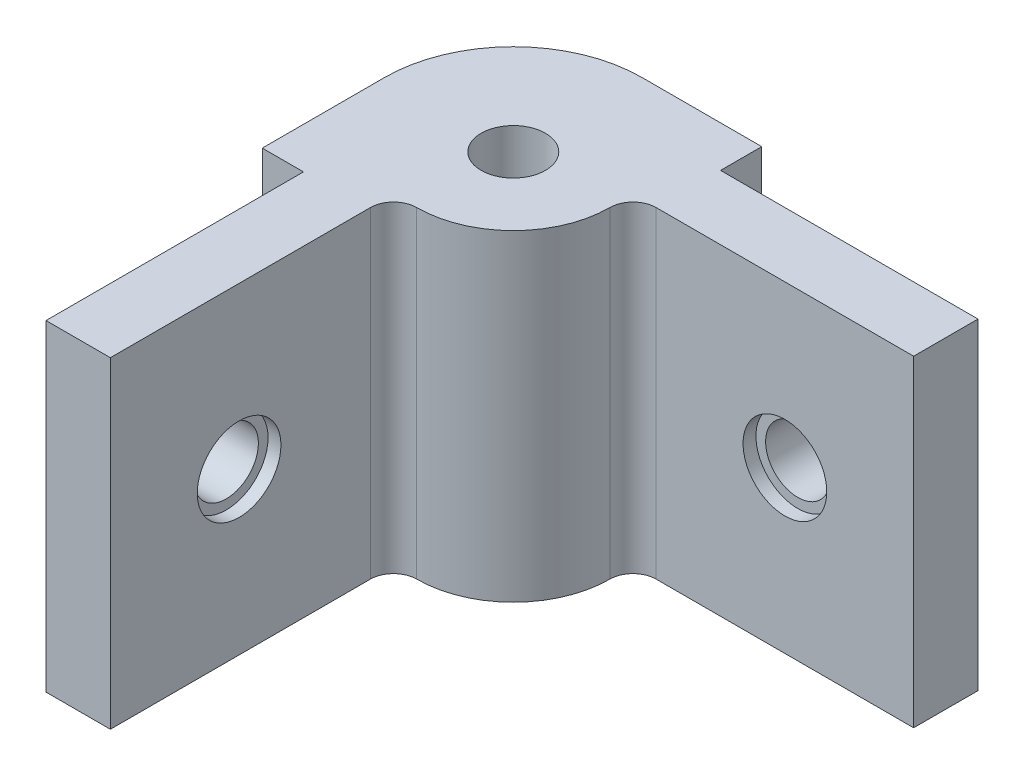
ISO-10303-21;
HEADER;
FILE_DESCRIPTION(('STEP AP214'),'2;1');
FILE_NAME('part.step','',(''),(''),'','','');
FILE_SCHEMA(('AUTOMOTIVE_DESIGN { 1 0 10303 214 1 1 1 1 }'));
ENDSEC;
DATA;
#1=APPLICATION_CONTEXT('core data for automotive mechanical design processes');
#2=APPLICATION_PROTOCOL_DEFINITION('international standard','automotive_design',2000,#1);
#3=PRODUCT_CONTEXT('',#1,'mechanical');
#4=PRODUCT('Part','Part','',(#3));
#5=PRODUCT_RELATED_PRODUCT_CATEGORY('part','',(#4));
#6=PRODUCT_DEFINITION_FORMATION('','',#4);
#7=PRODUCT_DEFINITION_CONTEXT('part definition',#1,'design');
#8=PRODUCT_DEFINITION('design','',#6,#7);
#9=PRODUCT_DEFINITION_SHAPE('','',#8);
#10=(LENGTH_UNIT() NAMED_UNIT(*) SI_UNIT(.MILLI.,.METRE.));
#11=(NAMED_UNIT(*) PLANE_ANGLE_UNIT() SI_UNIT($,.RADIAN.));
#12=(NAMED_UNIT(*) SI_UNIT($,.STERADIAN.) SOLID_ANGLE_UNIT());
#13=UNCERTAINTY_MEASURE_WITH_UNIT(LENGTH_MEASURE(1.E-05),#10,'distance_accuracy_value','');
#14=(GEOMETRIC_REPRESENTATION_CONTEXT(3) GLOBAL_UNCERTAINTY_ASSIGNED_CONTEXT((#13)) GLOBAL_UNIT_ASSIGNED_CONTEXT((#10,
#11,#12)) REPRESENTATION_CONTEXT('',''));
#15=CARTESIAN_POINT('',(0.,0.,0.));
#16=DIRECTION('',(0.,0.,1.));
#17=DIRECTION('',(1.,0.,0.));
#18=AXIS2_PLACEMENT_3D('',#15,#16,#17);
#19=CARTESIAN_POINT('',(22.8596517386988,12.5,16.9988360169487));
#20=DIRECTION('',(0.,0.,-1.));
#21=DIRECTION('',(-1.,0.,0.));
#22=AXIS2_PLACEMENT_3D('',#19,#20,#21);
#23=CYLINDRICAL_SURFACE('',#22,2.50000000000001);
#24=CARTESIAN_POINT('',(22.8596517386988,12.5,-19.3011639830492));
#25=DIRECTION('',(0.,0.,-1.));
#26=DIRECTION('',(-1.,0.,0.));
#27=AXIS2_PLACEMENT_3D('',#24,#25,#26);
#28=CIRCLE('',#27,2.50000000000001);
#29=CARTESIAN_POINT('',(20.3596517386988,12.5,-19.3011639830492));
#30=VERTEX_POINT('',#29);
#31=EDGE_CURVE('E297',#30,#30,#28,.T.);
#32=ORIENTED_EDGE('',*,*,#31,.T.);
#33=EDGE_LOOP('',(#32));
#34=FACE_BOUND('',#33,.T.);
#35=CARTESIAN_POINT('',(22.8596517386988,12.5,-15.3011639830541));
#36=DIRECTION('',(0.,0.,1.));
#37=DIRECTION('',(1.,0.,0.));
#38=AXIS2_PLACEMENT_3D('',#35,#36,#37);
#39=CIRCLE('',#38,2.50000000000001);
#40=CARTESIAN_POINT('',(25.3596517386988,12.5,-15.3011639830541));
#41=VERTEX_POINT('',#40);
#42=EDGE_CURVE('E42',#41,#41,#39,.F.);
#43=ORIENTED_EDGE('',*,*,#42,.F.);
#44=EDGE_LOOP('',(#43));
#45=FACE_BOUND('',#44,.T.);
#46=ADVANCED_FACE('F38',(#34,#45),#23,.F.);
#47=CARTESIAN_POINT('',(-6.44034826133112,12.5,6.99883601694872));
#48=DIRECTION('',(1.,0.,0.));
#49=DIRECTION('',(0.,0.,-1.));
#50=AXIS2_PLACEMENT_3D('',#47,#48,#49);
#51=CYLINDRICAL_SURFACE('',#50,2.5);
#52=CARTESIAN_POINT('',(-3.24034826133112,12.5,6.99883601694872));
#53=DIRECTION('',(1.,0.,0.));
#54=DIRECTION('',(0.,0.,-1.));
#55=AXIS2_PLACEMENT_3D('',#52,#53,#54);
#56=CIRCLE('',#55,2.5);
#57=CARTESIAN_POINT('',(-3.24034826133112,12.5,4.49883601694872));
#58=VERTEX_POINT('',#57);
#59=EDGE_CURVE('E289',#58,#58,#56,.T.);
#60=ORIENTED_EDGE('',*,*,#59,.F.);
#61=EDGE_LOOP('',(#60));
#62=FACE_BOUND('',#61,.T.);
#63=CARTESIAN_POINT('',(0.759651738668881,12.5,6.99883601694872));
#64=DIRECTION('',(1.,0.,0.));
#65=DIRECTION('',(0.,0.,-1.));
#66=AXIS2_PLACEMENT_3D('',#63,#64,#65);
#67=CIRCLE('',#66,2.5);
#68=CARTESIAN_POINT('',(0.759651738668881,12.5,4.49883601694872));
#69=VERTEX_POINT('',#68);
#70=EDGE_CURVE('E286',#69,#69,#67,.F.);
#71=ORIENTED_EDGE('',*,*,#70,.F.);
#72=EDGE_LOOP('',(#71));
#73=FACE_BOUND('',#72,.T.);
#74=ADVANCED_FACE('F378',(#62,#73),#51,.F.);
#75=CARTESIAN_POINT('',(3.55965173866673,25.,-3.20116398305856));
#76=DIRECTION('',(0.,1.,0.));
#77=DIRECTION('',(0.,0.,1.));
#78=AXIS2_PLACEMENT_3D('',#75,#76,#77);
#79=PLANE('',#78);
#80=DIRECTION('',(1.,0.,0.));
#81=VECTOR('',#80,1.);
#82=CARTESIAN_POINT('',(-6.44034826133112,25.,-3.00116398305128));
#83=LINE('',#82,#81);
#84=CARTESIAN_POINT('',(-6.44034826133112,25.,-3.00116398305128));
#85=VERTEX_POINT('',#84);
#86=CARTESIAN_POINT('',(-3.24034826133112,25.,-3.00116398305128));
#87=VERTEX_POINT('',#86);
#88=EDGE_CURVE('E246',#85,#87,#83,.T.);
#89=ORIENTED_EDGE('',*,*,#88,.T.);
#90=DIRECTION('',(0.,0.,1.));
#91=VECTOR('',#90,1.);
#92=CARTESIAN_POINT('',(-3.24034826133112,25.,-3.00116398305128));
#93=LINE('',#92,#91);
#94=CARTESIAN_POINT('',(-3.24034826133112,25.,16.9988360169487));
#95=VERTEX_POINT('',#94);
#96=EDGE_CURVE('E138',#87,#95,#93,.T.);
#97=ORIENTED_EDGE('',*,*,#96,.T.);
#98=DIRECTION('',(1.,0.,0.));
#99=VECTOR('',#98,1.);
#100=CARTESIAN_POINT('',(-3.24034826133112,25.,16.9988360169487));
#101=LINE('',#100,#99);
#102=CARTESIAN_POINT('',(1.75965173866888,25.,16.9988360169487));
#103=VERTEX_POINT('',#102);
#104=EDGE_CURVE('E325',#95,#103,#101,.T.);
#105=ORIENTED_EDGE('',*,*,#104,.T.);
#106=DIRECTION('',(0.,0.,-1.));
#107=VECTOR('',#106,1.);
#108=CARTESIAN_POINT('',(1.75965173866888,25.,-3.20116398305856));
#109=LINE('',#108,#107);
#110=CARTESIAN_POINT('',(1.75965173866888,25.,-3.20116398305856));
#111=VERTEX_POINT('',#110);
#112=EDGE_CURVE('E327',#103,#111,#109,.T.);
#113=ORIENTED_EDGE('',*,*,#112,.T.);
#114=CARTESIAN_POINT('',(3.55965173866673,25.,-3.20116398305856));
#115=DIRECTION('',(0.,-1.,0.));
#116=DIRECTION('',(0.,0.,1.));
#117=AXIS2_PLACEMENT_3D('',#114,#115,#116);
#118=CIRCLE('',#117,1.79999999999785);
#119=CARTESIAN_POINT('',(3.55965173866673,25.,-5.00116398305641));
#120=VERTEX_POINT('',#119);
#121=EDGE_CURVE('E329',#111,#120,#118,.T.);
#122=ORIENTED_EDGE('',*,*,#121,.T.);
#123=CARTESIAN_POINT('',(3.55965173866673,25.,-12.5011639830562));
#124=DIRECTION('',(0.,1.,0.));
#125=DIRECTION('',(0.,0.,-1.));
#126=AXIS2_PLACEMENT_3D('',#123,#124,#125);
#127=CIRCLE('',#126,7.49999999999982);
#128=CARTESIAN_POINT('',(11.0596517386666,25.,-12.5011639830562));
#129=VERTEX_POINT('',#128);
#130=EDGE_CURVE('E332',#120,#129,#127,.T.);
#131=ORIENTED_EDGE('',*,*,#130,.T.);
#132=CARTESIAN_POINT('',(12.8596517386644,25.,-12.5011639830562));
#133=DIRECTION('',(0.,-1.,0.));
#134=DIRECTION('',(0.,0.,-1.));
#135=AXIS2_PLACEMENT_3D('',#132,#133,#134);
#136=CIRCLE('',#135,1.79999999999785);
#137=CARTESIAN_POINT('',(12.8596517386644,25.,-14.3011639830541));
#138=VERTEX_POINT('',#137);
#139=EDGE_CURVE('E335',#129,#138,#136,.T.);
#140=ORIENTED_EDGE('',*,*,#139,.T.);
#141=DIRECTION('',(1.,0.,0.));
#142=VECTOR('',#141,1.);
#143=CARTESIAN_POINT('',(12.8596517386644,25.,-14.3011639830541));
#144=LINE('',#143,#142);
#145=CARTESIAN_POINT('',(32.8596517386987,25.,-14.3011639830541));
#146=VERTEX_POINT('',#145);
#147=EDGE_CURVE('E337',#138,#146,#144,.T.);
#148=ORIENTED_EDGE('',*,*,#147,.T.);
#149=DIRECTION('',(0.,0.,-1.));
#150=VECTOR('',#149,1.);
#151=CARTESIAN_POINT('',(32.8596517386987,25.,-19.3011639830492));
#152=LINE('',#151,#150);
#153=CARTESIAN_POINT('',(32.8596517386987,25.,-19.3011639830492));
#154=VERTEX_POINT('',#153);
#155=EDGE_CURVE('E340',#146,#154,#152,.T.);
#156=ORIENTED_EDGE('',*,*,#155,.T.);
#157=DIRECTION('',(-1.,0.,0.));
#158=VECTOR('',#157,1.);
#159=CARTESIAN_POINT('',(12.8596517386989,25.,-19.3011639830492));
#160=LINE('',#159,#158);
#161=CARTESIAN_POINT('',(12.8596517386989,25.,-19.3011639830492));
#162=VERTEX_POINT('',#161);
#163=EDGE_CURVE('E343',#154,#162,#160,.T.);
#164=ORIENTED_EDGE('',*,*,#163,.T.);
#165=DIRECTION('',(0.,0.,-1.));
#166=VECTOR('',#165,1.);
#167=CARTESIAN_POINT('',(12.8596517386989,25.,-22.5011639830541));
#168=LINE('',#167,#166);
#169=CARTESIAN_POINT('',(12.8596517386989,25.,-22.5011639830541));
#170=VERTEX_POINT('',#169);
#171=EDGE_CURVE('E182',#162,#170,#168,.T.);
#172=ORIENTED_EDGE('',*,*,#171,.T.);
#173=DIRECTION('',(-1.,0.,0.));
#174=VECTOR('',#173,1.);
#175=CARTESIAN_POINT('',(3.55965173866673,25.,-22.5011639830541));
#176=LINE('',#175,#174);
#177=CARTESIAN_POINT('',(3.55965173866673,25.,-22.5011639830541));
#178=VERTEX_POINT('',#177);
#179=EDGE_CURVE('E175',#170,#178,#176,.T.);
#180=ORIENTED_EDGE('',*,*,#179,.T.);
#181=CARTESIAN_POINT('',(3.55965173866673,25.,-12.5011639830562));
#182=DIRECTION('',(0.,1.,0.));
#183=DIRECTION('',(0.,0.,1.));
#184=AXIS2_PLACEMENT_3D('',#181,#182,#183);
#185=CIRCLE('',#184,9.99999999999785);
#186=CARTESIAN_POINT('',(-6.44034826133112,25.,-12.5011639830562));
#187=VERTEX_POINT('',#186);
#188=EDGE_CURVE('E180',#178,#187,#185,.T.);
#189=ORIENTED_EDGE('',*,*,#188,.T.);
#190=DIRECTION('',(0.,0.,1.));
#191=VECTOR('',#190,1.);
#192=CARTESIAN_POINT('',(-6.44034826133112,25.,-12.5011639830562));
#193=LINE('',#192,#191);
#194=EDGE_CURVE('E61',#187,#85,#193,.T.);
#195=ORIENTED_EDGE('',*,*,#194,.T.);
#196=EDGE_LOOP('',(#89,#97,#105,#113,#122,#131,#140,#148,#156,#164,#172,#180,#189,#195));
#197=FACE_BOUND('',#196,.T.);
#198=CARTESIAN_POINT('',(3.55965173866673,25.,-12.5011639830562));
#199=DIRECTION('',(0.,1.,0.));
#200=DIRECTION('',(0.,0.,1.));
#201=AXIS2_PLACEMENT_3D('',#198,#199,#200);
#202=CIRCLE('',#201,2.50000000000224);
#203=CARTESIAN_POINT('',(3.55965173866673,25.,-10.001163983054));
#204=VERTEX_POINT('',#203);
#205=EDGE_CURVE('E211',#204,#204,#202,.T.);
#206=ORIENTED_EDGE('',*,*,#205,.F.);
#207=EDGE_LOOP('',(#206));
#208=FACE_BOUND('',#207,.T.);
#209=ADVANCED_FACE('F177',(#197,#208),#79,.T.);
#210=CARTESIAN_POINT('',(3.55965173866673,0.,-3.20116398305856));
#211=DIRECTION('',(0.,1.,0.));
#212=DIRECTION('',(0.,0.,1.));
#213=AXIS2_PLACEMENT_3D('',#210,#211,#212);
#214=PLANE('',#213);
#215=DIRECTION('',(1.,0.,0.));
#216=VECTOR('',#215,1.);
#217=CARTESIAN_POINT('',(-6.44034826133112,0.,-3.00116398305128));
#218=LINE('',#217,#216);
#219=CARTESIAN_POINT('',(-6.44034826133112,0.,-3.00116398305128));
#220=VERTEX_POINT('',#219);
#221=CARTESIAN_POINT('',(-3.24034826133112,0.,-3.00116398305128));
#222=VERTEX_POINT('',#221);
#223=EDGE_CURVE('E206',#220,#222,#218,.T.);
#224=ORIENTED_EDGE('',*,*,#223,.F.);
#225=DIRECTION('',(0.,0.,1.));
#226=VECTOR('',#225,1.);
#227=CARTESIAN_POINT('',(-6.44034826133112,0.,-12.5011639830562));
#228=LINE('',#227,#226);
#229=CARTESIAN_POINT('',(-6.44034826133112,0.,-12.5011639830562));
#230=VERTEX_POINT('',#229);
#231=EDGE_CURVE('E129',#230,#220,#228,.T.);
#232=ORIENTED_EDGE('',*,*,#231,.F.);
#233=CARTESIAN_POINT('',(3.55965173866673,0.,-12.5011639830562));
#234=DIRECTION('',(0.,1.,0.));
#235=DIRECTION('',(0.,0.,1.));
#236=AXIS2_PLACEMENT_3D('',#233,#234,#235);
#237=CIRCLE('',#236,9.99999999999785);
#238=CARTESIAN_POINT('',(3.55965173866673,0.,-22.5011639830541));
#239=VERTEX_POINT('',#238);
#240=EDGE_CURVE('E121',#239,#230,#237,.T.);
#241=ORIENTED_EDGE('',*,*,#240,.F.);
#242=DIRECTION('',(-1.,0.,0.));
#243=VECTOR('',#242,1.);
#244=CARTESIAN_POINT('',(3.55965173866673,0.,-22.5011639830541));
#245=LINE('',#244,#243);
#246=CARTESIAN_POINT('',(12.8596517386989,0.,-22.5011639830541));
#247=VERTEX_POINT('',#246);
#248=EDGE_CURVE('E191',#247,#239,#245,.T.);
#249=ORIENTED_EDGE('',*,*,#248,.F.);
#250=DIRECTION('',(0.,0.,-1.));
#251=VECTOR('',#250,1.);
#252=CARTESIAN_POINT('',(12.8596517386989,0.,-22.5011639830541));
#253=LINE('',#252,#251);
#254=CARTESIAN_POINT('',(12.8596517386989,0.,-19.3011639830492));
#255=VERTEX_POINT('',#254);
#256=EDGE_CURVE('E237',#255,#247,#253,.T.);
#257=ORIENTED_EDGE('',*,*,#256,.F.);
#258=DIRECTION('',(-1.,0.,0.));
#259=VECTOR('',#258,1.);
#260=CARTESIAN_POINT('',(12.8596517386989,0.,-19.3011639830492));
#261=LINE('',#260,#259);
#262=CARTESIAN_POINT('',(32.8596517386987,0.,-19.3011639830492));
#263=VERTEX_POINT('',#262);
#264=EDGE_CURVE('E234',#263,#255,#261,.T.);
#265=ORIENTED_EDGE('',*,*,#264,.F.);
#266=DIRECTION('',(0.,0.,-1.));
#267=VECTOR('',#266,1.);
#268=CARTESIAN_POINT('',(32.8596517386987,0.,-19.3011639830492));
#269=LINE('',#268,#267);
#270=CARTESIAN_POINT('',(32.8596517386987,0.,-14.3011639830541));
#271=VERTEX_POINT('',#270);
#272=EDGE_CURVE('E231',#271,#263,#269,.T.);
#273=ORIENTED_EDGE('',*,*,#272,.F.);
#274=DIRECTION('',(1.,0.,0.));
#275=VECTOR('',#274,1.);
#276=CARTESIAN_POINT('',(12.8596517386644,0.,-14.3011639830541));
#277=LINE('',#276,#275);
#278=CARTESIAN_POINT('',(12.8596517386644,0.,-14.3011639830541));
#279=VERTEX_POINT('',#278);
#280=EDGE_CURVE('E228',#279,#271,#277,.T.);
#281=ORIENTED_EDGE('',*,*,#280,.F.);
#282=CARTESIAN_POINT('',(12.8596517386644,0.,-12.5011639830562));
#283=DIRECTION('',(0.,-1.,0.));
#284=DIRECTION('',(0.,0.,-1.));
#285=AXIS2_PLACEMENT_3D('',#282,#283,#284);
#286=CIRCLE('',#285,1.79999999999785);
#287=CARTESIAN_POINT('',(11.0596517386666,0.,-12.5011639830562));
#288=VERTEX_POINT('',#287);
#289=EDGE_CURVE('E225',#288,#279,#286,.T.);
#290=ORIENTED_EDGE('',*,*,#289,.F.);
#291=CARTESIAN_POINT('',(3.55965173866673,0.,-12.5011639830562));
#292=DIRECTION('',(0.,1.,0.));
#293=DIRECTION('',(0.,0.,-1.));
#294=AXIS2_PLACEMENT_3D('',#291,#292,#293);
#295=CIRCLE('',#294,7.49999999999982);
#296=CARTESIAN_POINT('',(3.55965173866673,0.,-5.00116398305641));
#297=VERTEX_POINT('',#296);
#298=EDGE_CURVE('E222',#297,#288,#295,.T.);
#299=ORIENTED_EDGE('',*,*,#298,.F.);
#300=CARTESIAN_POINT('',(3.55965173866673,0.,-3.20116398305856));
#301=DIRECTION('',(0.,-1.,0.));
#302=DIRECTION('',(0.,0.,1.));
#303=AXIS2_PLACEMENT_3D('',#300,#301,#302);
#304=CIRCLE('',#303,1.79999999999785);
#305=CARTESIAN_POINT('',(1.75965173866888,0.,-3.20116398305856));
#306=VERTEX_POINT('',#305);
#307=EDGE_CURVE('E219',#306,#297,#304,.T.);
#308=ORIENTED_EDGE('',*,*,#307,.F.);
#309=DIRECTION('',(0.,0.,-1.));
#310=VECTOR('',#309,1.);
#311=CARTESIAN_POINT('',(1.75965173866888,0.,-3.20116398305856));
#312=LINE('',#311,#310);
#313=CARTESIAN_POINT('',(1.75965173866888,0.,16.9988360169487));
#314=VERTEX_POINT('',#313);
#315=EDGE_CURVE('E216',#314,#306,#312,.T.);
#316=ORIENTED_EDGE('',*,*,#315,.F.);
#317=DIRECTION('',(1.,0.,0.));
#318=VECTOR('',#317,1.);
#319=CARTESIAN_POINT('',(-3.24034826133112,0.,16.9988360169487));
#320=LINE('',#319,#318);
#321=CARTESIAN_POINT('',(-3.24034826133112,0.,16.9988360169487));
#322=VERTEX_POINT('',#321);
#323=EDGE_CURVE('E214',#322,#314,#320,.T.);
#324=ORIENTED_EDGE('',*,*,#323,.F.);
#325=DIRECTION('',(0.,0.,1.));
#326=VECTOR('',#325,1.);
#327=CARTESIAN_POINT('',(-3.24034826133112,0.,-3.00116398305128));
#328=LINE('',#327,#326);
#329=EDGE_CURVE('E210',#222,#322,#328,.T.);
#330=ORIENTED_EDGE('',*,*,#329,.F.);
#331=EDGE_LOOP('',(#224,#232,#241,#249,#257,#265,#273,#281,#290,#299,#308,#316,#324,#330));
#332=FACE_BOUND('',#331,.T.);
#333=CARTESIAN_POINT('',(3.55965173866673,0.,-12.5011639830562));
#334=DIRECTION('',(0.,1.,0.));
#335=DIRECTION('',(0.,0.,1.));
#336=AXIS2_PLACEMENT_3D('',#333,#334,#335);
#337=CIRCLE('',#336,2.50000000000224);
#338=CARTESIAN_POINT('',(3.55965173866673,0.,-10.001163983054));
#339=VERTEX_POINT('',#338);
#340=EDGE_CURVE('E314',#339,#339,#337,.T.);
#341=ORIENTED_EDGE('',*,*,#340,.T.);
#342=EDGE_LOOP('',(#341));
#343=FACE_BOUND('',#342,.T.);
#344=ADVANCED_FACE('F358',(#332,#343),#214,.F.);
#345=CARTESIAN_POINT('',(-6.44034826133112,25.,-3.00116398305128));
#346=DIRECTION('',(0.,0.,-1.));
#347=DIRECTION('',(-1.,0.,0.));
#348=AXIS2_PLACEMENT_3D('',#345,#346,#347);
#349=PLANE('',#348);
#350=ORIENTED_EDGE('',*,*,#223,.T.);
#351=DIRECTION('',(0.,-1.,0.));
#352=VECTOR('',#351,1.);
#353=CARTESIAN_POINT('',(-3.24034826133112,25.,-3.00116398305128));
#354=LINE('',#353,#352);
#355=EDGE_CURVE('E11',#87,#222,#354,.T.);
#356=ORIENTED_EDGE('',*,*,#355,.F.);
#357=ORIENTED_EDGE('',*,*,#88,.F.);
#358=DIRECTION('',(0.,-1.,0.));
#359=VECTOR('',#358,1.);
#360=CARTESIAN_POINT('',(-6.44034826133112,25.,-3.00116398305128));
#361=LINE('',#360,#359);
#362=EDGE_CURVE('E202',#85,#220,#361,.T.);
#363=ORIENTED_EDGE('',*,*,#362,.T.);
#364=EDGE_LOOP('',(#350,#356,#357,#363));
#365=FACE_BOUND('',#364,.T.);
#366=ADVANCED_FACE('F40',(#365),#349,.F.);
#367=CARTESIAN_POINT('',(-3.24034826133112,25.,-3.00116398305128));
#368=DIRECTION('',(1.,0.,0.));
#369=DIRECTION('',(0.,0.,-1.));
#370=AXIS2_PLACEMENT_3D('',#367,#368,#369);
#371=PLANE('',#370);
#372=ORIENTED_EDGE('',*,*,#59,.T.);
#373=EDGE_LOOP('',(#372));
#374=FACE_BOUND('',#373,.T.);
#375=ORIENTED_EDGE('',*,*,#329,.T.);
#376=DIRECTION('',(0.,-1.,0.));
#377=VECTOR('',#376,1.);
#378=CARTESIAN_POINT('',(-3.24034826133112,25.,16.9988360169487));
#379=LINE('',#378,#377);
#380=EDGE_CURVE('E49',#95,#322,#379,.T.);
#381=ORIENTED_EDGE('',*,*,#380,.F.);
#382=ORIENTED_EDGE('',*,*,#96,.F.);
#383=ORIENTED_EDGE('',*,*,#355,.T.);
#384=EDGE_LOOP('',(#375,#381,#382,#383));
#385=FACE_BOUND('',#384,.T.);
#386=ADVANCED_FACE('F394',(#374,#385),#371,.F.);
#387=CARTESIAN_POINT('',(-3.24034826133112,25.,16.9988360169487));
#388=DIRECTION('',(0.,0.,-1.));
#389=DIRECTION('',(-1.,0.,0.));
#390=AXIS2_PLACEMENT_3D('',#387,#388,#389);
#391=PLANE('',#390);
#392=ORIENTED_EDGE('',*,*,#323,.T.);
#393=DIRECTION('',(0.,-1.,0.));
#394=VECTOR('',#393,1.);
#395=CARTESIAN_POINT('',(1.75965173866888,25.,16.9988360169487));
#396=LINE('',#395,#394);
#397=EDGE_CURVE('E281',#103,#314,#396,.T.);
#398=ORIENTED_EDGE('',*,*,#397,.F.);
#399=ORIENTED_EDGE('',*,*,#104,.F.);
#400=ORIENTED_EDGE('',*,*,#380,.T.);
#401=EDGE_LOOP('',(#392,#398,#399,#400));
#402=FACE_BOUND('',#401,.T.);
#403=ADVANCED_FACE('F398',(#402),#391,.F.);
#404=CARTESIAN_POINT('',(1.75965173866888,25.,-3.20116398305856));
#405=DIRECTION('',(-1.,0.,0.));
#406=DIRECTION('',(0.,0.,1.));
#407=AXIS2_PLACEMENT_3D('',#404,#405,#406);
#408=PLANE('',#407);
#409=CARTESIAN_POINT('',(1.75965173866888,12.5,6.99883601694872));
#410=DIRECTION('',(1.,0.,0.));
#411=DIRECTION('',(0.,0.,-1.));
#412=AXIS2_PLACEMENT_3D('',#409,#410,#411);
#413=CIRCLE('',#412,3.25);
#414=CARTESIAN_POINT('',(1.75965173866888,12.5,3.74883601694872));
#415=VERTEX_POINT('',#414);
#416=EDGE_CURVE('E301',#415,#415,#413,.T.);
#417=ORIENTED_EDGE('',*,*,#416,.F.);
#418=EDGE_LOOP('',(#417));
#419=FACE_BOUND('',#418,.T.);
#420=ORIENTED_EDGE('',*,*,#315,.T.);
#421=DIRECTION('',(0.,-1.,0.));
#422=VECTOR('',#421,1.);
#423=CARTESIAN_POINT('',(1.75965173866888,25.,-3.20116398305856));
#424=LINE('',#423,#422);
#425=EDGE_CURVE('E277',#111,#306,#424,.T.);
#426=ORIENTED_EDGE('',*,*,#425,.F.);
#427=ORIENTED_EDGE('',*,*,#112,.F.);
#428=ORIENTED_EDGE('',*,*,#397,.T.);
#429=EDGE_LOOP('',(#420,#426,#427,#428));
#430=FACE_BOUND('',#429,.T.);
#431=ADVANCED_FACE('F403',(#419,#430),#408,.F.);
#432=CARTESIAN_POINT('',(3.55965173866673,25.,-3.20116398305856));
#433=DIRECTION('',(0.,-1.,0.));
#434=DIRECTION('',(0.,0.,-1.));
#435=AXIS2_PLACEMENT_3D('',#432,#433,#434);
#436=CYLINDRICAL_SURFACE('',#435,1.79999999999785);
#437=ORIENTED_EDGE('',*,*,#307,.T.);
#438=DIRECTION('',(0.,-1.,0.));
#439=VECTOR('',#438,1.);
#440=CARTESIAN_POINT('',(3.55965173866673,25.,-5.00116398305641));
#441=LINE('',#440,#439);
#442=EDGE_CURVE('E273',#120,#297,#441,.T.);
#443=ORIENTED_EDGE('',*,*,#442,.F.);
#444=ORIENTED_EDGE('',*,*,#121,.F.);
#445=ORIENTED_EDGE('',*,*,#425,.T.);
#446=EDGE_LOOP('',(#437,#443,#444,#445));
#447=FACE_BOUND('',#446,.T.);
#448=ADVANCED_FACE('F409',(#447),#436,.F.);
#449=CARTESIAN_POINT('',(3.55965173866673,25.,-12.5011639830562));
#450=DIRECTION('',(0.,-1.,0.));
#451=DIRECTION('',(0.,0.,-1.));
#452=AXIS2_PLACEMENT_3D('',#449,#450,#451);
#453=CYLINDRICAL_SURFACE('',#452,7.49999999999982);
#454=ORIENTED_EDGE('',*,*,#298,.T.);
#455=DIRECTION('',(0.,-1.,0.));
#456=VECTOR('',#455,1.);
#457=CARTESIAN_POINT('',(11.0596517386666,25.,-12.5011639830562));
#458=LINE('',#457,#456);
#459=EDGE_CURVE('E269',#129,#288,#458,.T.);
#460=ORIENTED_EDGE('',*,*,#459,.F.);
#461=ORIENTED_EDGE('',*,*,#130,.F.);
#462=ORIENTED_EDGE('',*,*,#442,.T.);
#463=EDGE_LOOP('',(#454,#460,#461,#462));
#464=FACE_BOUND('',#463,.T.);
#465=ADVANCED_FACE('F413',(#464),#453,.T.);
#466=CARTESIAN_POINT('',(12.8596517386644,25.,-12.5011639830562));
#467=DIRECTION('',(0.,-1.,0.));
#468=DIRECTION('',(0.,0.,-1.));
#469=AXIS2_PLACEMENT_3D('',#466,#467,#468);
#470=CYLINDRICAL_SURFACE('',#469,1.79999999999785);
#471=ORIENTED_EDGE('',*,*,#289,.T.);
#472=DIRECTION('',(0.,-1.,0.));
#473=VECTOR('',#472,1.);
#474=CARTESIAN_POINT('',(12.8596517386644,25.,-14.3011639830541));
#475=LINE('',#474,#473);
#476=EDGE_CURVE('E265',#138,#279,#475,.T.);
#477=ORIENTED_EDGE('',*,*,#476,.F.);
#478=ORIENTED_EDGE('',*,*,#139,.F.);
#479=ORIENTED_EDGE('',*,*,#459,.T.);
#480=EDGE_LOOP('',(#471,#477,#478,#479));
#481=FACE_BOUND('',#480,.T.);
#482=ADVANCED_FACE('F417',(#481),#470,.F.);
#483=CARTESIAN_POINT('',(12.8596517386644,25.,-14.3011639830541));
#484=DIRECTION('',(0.,0.,-1.));
#485=DIRECTION('',(-1.,0.,0.));
#486=AXIS2_PLACEMENT_3D('',#483,#484,#485);
#487=PLANE('',#486);
#488=CARTESIAN_POINT('',(22.8596517386988,12.5,-14.3011639830541));
#489=DIRECTION('',(0.,0.,1.));
#490=DIRECTION('',(1.,0.,0.));
#491=AXIS2_PLACEMENT_3D('',#488,#489,#490);
#492=CIRCLE('',#491,3.25);
#493=CARTESIAN_POINT('',(26.1096517386988,12.5,-14.3011639830541));
#494=VERTEX_POINT('',#493);
#495=EDGE_CURVE('E308',#494,#494,#492,.T.);
#496=ORIENTED_EDGE('',*,*,#495,.F.);
#497=EDGE_LOOP('',(#496));
#498=FACE_BOUND('',#497,.T.);
#499=ORIENTED_EDGE('',*,*,#280,.T.);
#500=DIRECTION('',(0.,-1.,0.));
#501=VECTOR('',#500,1.);
#502=CARTESIAN_POINT('',(32.8596517386987,25.,-14.3011639830541));
#503=LINE('',#502,#501);
#504=EDGE_CURVE('E261',#146,#271,#503,.T.);
#505=ORIENTED_EDGE('',*,*,#504,.F.);
#506=ORIENTED_EDGE('',*,*,#147,.F.);
#507=ORIENTED_EDGE('',*,*,#476,.T.);
#508=EDGE_LOOP('',(#499,#505,#506,#507));
#509=FACE_BOUND('',#508,.T.);
#510=ADVANCED_FACE('F421',(#498,#509),#487,.F.);
#511=CARTESIAN_POINT('',(32.8596517386987,25.,-19.3011639830492));
#512=DIRECTION('',(-1.,0.,0.));
#513=DIRECTION('',(0.,0.,1.));
#514=AXIS2_PLACEMENT_3D('',#511,#512,#513);
#515=PLANE('',#514);
#516=ORIENTED_EDGE('',*,*,#272,.T.);
#517=DIRECTION('',(0.,-1.,0.));
#518=VECTOR('',#517,1.);
#519=CARTESIAN_POINT('',(32.8596517386987,25.,-19.3011639830492));
#520=LINE('',#519,#518);
#521=EDGE_CURVE('E257',#154,#263,#520,.T.);
#522=ORIENTED_EDGE('',*,*,#521,.F.);
#523=ORIENTED_EDGE('',*,*,#155,.F.);
#524=ORIENTED_EDGE('',*,*,#504,.T.);
#525=EDGE_LOOP('',(#516,#522,#523,#524));
#526=FACE_BOUND('',#525,.T.);
#527=ADVANCED_FACE('F425',(#526),#515,.F.);
#528=CARTESIAN_POINT('',(12.8596517386989,25.,-19.3011639830492));
#529=DIRECTION('',(0.,0.,1.));
#530=DIRECTION('',(1.,0.,0.));
#531=AXIS2_PLACEMENT_3D('',#528,#529,#530);
#532=PLANE('',#531);
#533=ORIENTED_EDGE('',*,*,#31,.F.);
#534=EDGE_LOOP('',(#533));
#535=FACE_BOUND('',#534,.T.);
#536=ORIENTED_EDGE('',*,*,#264,.T.);
#537=DIRECTION('',(0.,-1.,0.));
#538=VECTOR('',#537,1.);
#539=CARTESIAN_POINT('',(12.8596517386989,25.,-19.3011639830492));
#540=LINE('',#539,#538);
#541=EDGE_CURVE('E253',#162,#255,#540,.T.);
#542=ORIENTED_EDGE('',*,*,#541,.F.);
#543=ORIENTED_EDGE('',*,*,#163,.F.);
#544=ORIENTED_EDGE('',*,*,#521,.T.);
#545=EDGE_LOOP('',(#536,#542,#543,#544));
#546=FACE_BOUND('',#545,.T.);
#547=ADVANCED_FACE('F351',(#535,#546),#532,.F.);
#548=CARTESIAN_POINT('',(12.8596517386989,25.,-22.5011639830541));
#549=DIRECTION('',(-1.,0.,0.));
#550=DIRECTION('',(0.,0.,1.));
#551=AXIS2_PLACEMENT_3D('',#548,#549,#550);
#552=PLANE('',#551);
#553=ORIENTED_EDGE('',*,*,#256,.T.);
#554=DIRECTION('',(0.,-1.,0.));
#555=VECTOR('',#554,1.);
#556=CARTESIAN_POINT('',(12.8596517386989,25.,-22.5011639830541));
#557=LINE('',#556,#555);
#558=EDGE_CURVE('E193',#170,#247,#557,.T.);
#559=ORIENTED_EDGE('',*,*,#558,.F.);
#560=ORIENTED_EDGE('',*,*,#171,.F.);
#561=ORIENTED_EDGE('',*,*,#541,.T.);
#562=EDGE_LOOP('',(#553,#559,#560,#561));
#563=FACE_BOUND('',#562,.T.);
#564=ADVANCED_FACE('F355',(#563),#552,.F.);
#565=CARTESIAN_POINT('',(3.55965173866673,25.,-22.5011639830541));
#566=DIRECTION('',(0.,0.,1.));
#567=DIRECTION('',(1.,0.,0.));
#568=AXIS2_PLACEMENT_3D('',#565,#566,#567);
#569=PLANE('',#568);
#570=ORIENTED_EDGE('',*,*,#248,.T.);
#571=DIRECTION('',(0.,-1.,0.));
#572=VECTOR('',#571,1.);
#573=CARTESIAN_POINT('',(3.55965173866673,25.,-22.5011639830541));
#574=LINE('',#573,#572);
#575=EDGE_CURVE('E188',#178,#239,#574,.T.);
#576=ORIENTED_EDGE('',*,*,#575,.F.);
#577=ORIENTED_EDGE('',*,*,#179,.F.);
#578=ORIENTED_EDGE('',*,*,#558,.T.);
#579=EDGE_LOOP('',(#570,#576,#577,#578));
#580=FACE_BOUND('',#579,.T.);
#581=ADVANCED_FACE('F189',(#580),#569,.F.);
#582=CARTESIAN_POINT('',(3.55965173866673,25.,-12.5011639830562));
#583=DIRECTION('',(0.,-1.,0.));
#584=DIRECTION('',(0.,0.,-1.));
#585=AXIS2_PLACEMENT_3D('',#582,#583,#584);
#586=CYLINDRICAL_SURFACE('',#585,9.99999999999785);
#587=ORIENTED_EDGE('',*,*,#240,.T.);
#588=DIRECTION('',(0.,-1.,0.));
#589=VECTOR('',#588,1.);
#590=CARTESIAN_POINT('',(-6.44034826133112,25.,-12.5011639830562));
#591=LINE('',#590,#589);
#592=EDGE_CURVE('E194',#187,#230,#591,.T.);
#593=ORIENTED_EDGE('',*,*,#592,.F.);
#594=ORIENTED_EDGE('',*,*,#188,.F.);
#595=ORIENTED_EDGE('',*,*,#575,.T.);
#596=EDGE_LOOP('',(#587,#593,#594,#595));
#597=FACE_BOUND('',#596,.T.);
#598=ADVANCED_FACE('F196',(#597),#586,.T.);
#599=CARTESIAN_POINT('',(-6.44034826133112,25.,-12.5011639830562));
#600=DIRECTION('',(1.,0.,0.));
#601=DIRECTION('',(0.,0.,-1.));
#602=AXIS2_PLACEMENT_3D('',#599,#600,#601);
#603=PLANE('',#602);
#604=ORIENTED_EDGE('',*,*,#231,.T.);
#605=ORIENTED_EDGE('',*,*,#362,.F.);
#606=ORIENTED_EDGE('',*,*,#194,.F.);
#607=ORIENTED_EDGE('',*,*,#592,.T.);
#608=EDGE_LOOP('',(#604,#605,#606,#607));
#609=FACE_BOUND('',#608,.T.);
#610=ADVANCED_FACE('F364',(#609),#603,.F.);
#611=CARTESIAN_POINT('',(3.55965173866673,25.,-12.5011639830562));
#612=DIRECTION('',(0.,-1.,0.));
#613=DIRECTION('',(0.,0.,-1.));
#614=AXIS2_PLACEMENT_3D('',#611,#612,#613);
#615=CYLINDRICAL_SURFACE('',#614,2.50000000000224);
#616=ORIENTED_EDGE('',*,*,#205,.T.);
#617=EDGE_LOOP('',(#616));
#618=FACE_BOUND('',#617,.T.);
#619=ORIENTED_EDGE('',*,*,#340,.F.);
#620=EDGE_LOOP('',(#619));
#621=FACE_BOUND('',#620,.T.);
#622=ADVANCED_FACE('F366',(#618,#621),#615,.F.);
#623=CARTESIAN_POINT('',(0.759651738668881,12.5,6.99883601694872));
#624=DIRECTION('',(1.,0.,0.));
#625=DIRECTION('',(0.,0.,-1.));
#626=AXIS2_PLACEMENT_3D('',#623,#624,#625);
#627=PLANE('',#626);
#628=CARTESIAN_POINT('',(0.759651738668881,12.5,6.99883601694872));
#629=DIRECTION('',(1.,0.,0.));
#630=DIRECTION('',(0.,0.,-1.));
#631=AXIS2_PLACEMENT_3D('',#628,#629,#630);
#632=CIRCLE('',#631,3.25);
#633=CARTESIAN_POINT('',(0.759651738668881,12.5,3.74883601694872));
#634=VERTEX_POINT('',#633);
#635=EDGE_CURVE('E290',#634,#634,#632,.T.);
#636=ORIENTED_EDGE('',*,*,#635,.T.);
#637=EDGE_LOOP('',(#636));
#638=FACE_BOUND('',#637,.T.);
#639=ORIENTED_EDGE('',*,*,#70,.T.);
#640=EDGE_LOOP('',(#639));
#641=FACE_BOUND('',#640,.T.);
#642=ADVANCED_FACE('F372',(#638,#641),#627,.T.);
#643=CARTESIAN_POINT('',(0.759651738668881,12.5,6.99883601694872));
#644=DIRECTION('',(1.,0.,0.));
#645=DIRECTION('',(0.,0.,-1.));
#646=AXIS2_PLACEMENT_3D('',#643,#644,#645);
#647=CYLINDRICAL_SURFACE('',#646,3.25);
#648=ORIENTED_EDGE('',*,*,#635,.F.);
#649=EDGE_LOOP('',(#648));
#650=FACE_BOUND('',#649,.T.);
#651=ORIENTED_EDGE('',*,*,#416,.T.);
#652=EDGE_LOOP('',(#651));
#653=FACE_BOUND('',#652,.T.);
#654=ADVANCED_FACE('F521',(#650,#653),#647,.F.);
#655=CARTESIAN_POINT('',(22.8596517386988,12.5,-15.3011639830541));
#656=DIRECTION('',(0.,0.,1.));
#657=DIRECTION('',(1.,0.,0.));
#658=AXIS2_PLACEMENT_3D('',#655,#656,#657);
#659=PLANE('',#658);
#660=CARTESIAN_POINT('',(22.8596517386988,12.5,-15.3011639830541));
#661=DIRECTION('',(0.,0.,1.));
#662=DIRECTION('',(1.,0.,0.));
#663=AXIS2_PLACEMENT_3D('',#660,#661,#662);
#664=CIRCLE('',#663,3.25);
#665=CARTESIAN_POINT('',(26.1096517386988,12.5,-15.3011639830541));
#666=VERTEX_POINT('',#665);
#667=EDGE_CURVE('E590',#666,#666,#664,.T.);
#668=ORIENTED_EDGE('',*,*,#667,.T.);
#669=EDGE_LOOP('',(#668));
#670=FACE_BOUND('',#669,.T.);
#671=ORIENTED_EDGE('',*,*,#42,.T.);
#672=EDGE_LOOP('',(#671));
#673=FACE_BOUND('',#672,.T.);
#674=ADVANCED_FACE('F529',(#670,#673),#659,.T.);
#675=CARTESIAN_POINT('',(22.8596517386988,12.5,-15.3011639830541));
#676=DIRECTION('',(0.,0.,1.));
#677=DIRECTION('',(1.,0.,0.));
#678=AXIS2_PLACEMENT_3D('',#675,#676,#677);
#679=CYLINDRICAL_SURFACE('',#678,3.25);
#680=ORIENTED_EDGE('',*,*,#667,.F.);
#681=EDGE_LOOP('',(#680));
#682=FACE_BOUND('',#681,.T.);
#683=ORIENTED_EDGE('',*,*,#495,.T.);
#684=EDGE_LOOP('',(#683));
#685=FACE_BOUND('',#684,.T.);
#686=ADVANCED_FACE('F540',(#682,#685),#679,.F.);
#687=CLOSED_SHELL('',(#46,#74,#209,#344,#366,#386,#403,#431,#448,#465,#482,#510,#527,#547,#564,
#581,#598,#610,#622,#642,#654,#674,#686));
#688=MANIFOLD_SOLID_BREP('B2',#687);
#689=ADVANCED_BREP_SHAPE_REPRESENTATION('',(#18,#688),#14);
#690=SHAPE_DEFINITION_REPRESENTATION(#9,#689);
ENDSEC;
END-ISO-10303-21;
